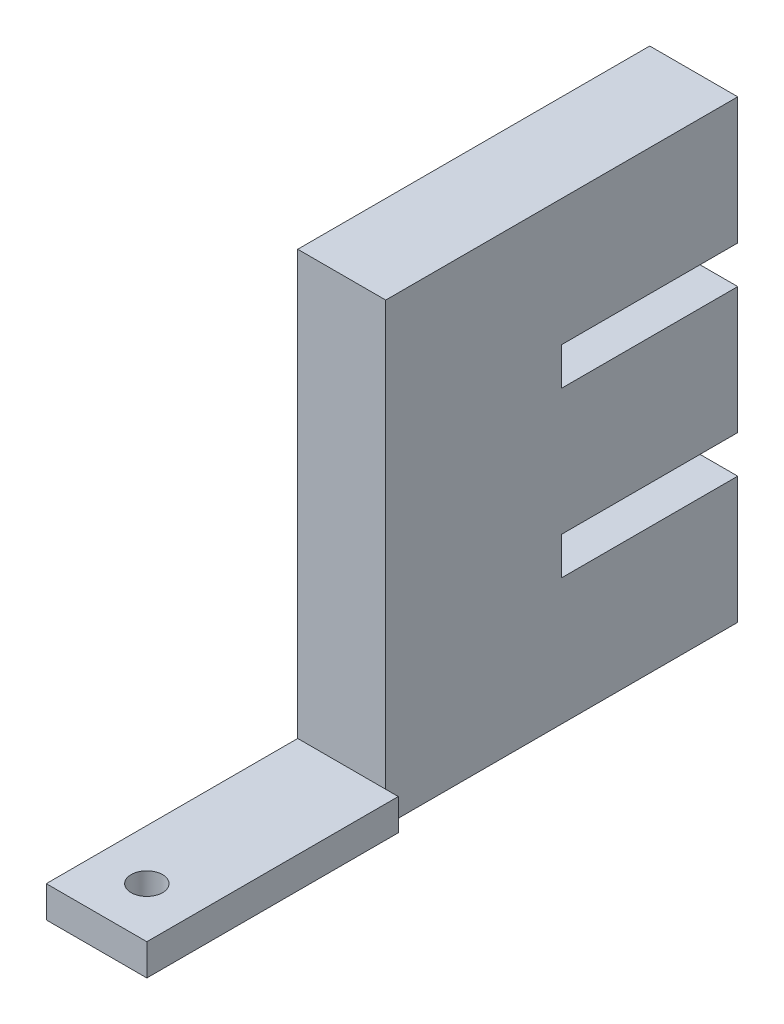
ISO-10303-21;
HEADER;
FILE_DESCRIPTION(('STEP AP214'),'2;1');
FILE_NAME('part.step','',(''),(''),'','','');
FILE_SCHEMA(('AUTOMOTIVE_DESIGN { 1 0 10303 214 1 1 1 1 }'));
ENDSEC;
DATA;
#1=APPLICATION_CONTEXT('core data for automotive mechanical design processes');
#2=APPLICATION_PROTOCOL_DEFINITION('international standard','automotive_design',2000,#1);
#3=PRODUCT_CONTEXT('',#1,'mechanical');
#4=PRODUCT('Part','Part','',(#3));
#5=PRODUCT_RELATED_PRODUCT_CATEGORY('part','',(#4));
#6=PRODUCT_DEFINITION_FORMATION('','',#4);
#7=PRODUCT_DEFINITION_CONTEXT('part definition',#1,'design');
#8=PRODUCT_DEFINITION('design','',#6,#7);
#9=PRODUCT_DEFINITION_SHAPE('','',#8);
#10=(LENGTH_UNIT() NAMED_UNIT(*) SI_UNIT(.MILLI.,.METRE.));
#11=(NAMED_UNIT(*) PLANE_ANGLE_UNIT() SI_UNIT($,.RADIAN.));
#12=(NAMED_UNIT(*) SI_UNIT($,.STERADIAN.) SOLID_ANGLE_UNIT());
#13=UNCERTAINTY_MEASURE_WITH_UNIT(LENGTH_MEASURE(1.E-05),#10,'distance_accuracy_value','');
#14=(GEOMETRIC_REPRESENTATION_CONTEXT(3) GLOBAL_UNCERTAINTY_ASSIGNED_CONTEXT((#13)) GLOBAL_UNIT_ASSIGNED_CONTEXT((#10,
#11,#12)) REPRESENTATION_CONTEXT('',''));
#15=CARTESIAN_POINT('',(0.,0.,0.));
#16=DIRECTION('',(0.,0.,1.));
#17=DIRECTION('',(1.,0.,0.));
#18=AXIS2_PLACEMENT_3D('',#15,#16,#17);
#19=CARTESIAN_POINT('',(-4.,-2.,4.));
#20=DIRECTION('',(1.,0.,0.));
#21=DIRECTION('',(0.,0.,-1.));
#22=AXIS2_PLACEMENT_3D('',#19,#20,#21);
#23=PLANE('',#22);
#24=DIRECTION('',(0.,0.,1.));
#25=VECTOR('',#24,1.);
#26=CARTESIAN_POINT('',(-4.,18.63,4.));
#27=LINE('',#26,#25);
#28=CARTESIAN_POINT('',(-4.,18.63,-44.));
#29=VERTEX_POINT('',#28);
#30=CARTESIAN_POINT('',(-4.,18.63,-30.));
#31=VERTEX_POINT('',#30);
#32=EDGE_CURVE('E175',#29,#31,#27,.T.);
#33=ORIENTED_EDGE('',*,*,#32,.F.);
#34=DIRECTION('',(0.,-1.,0.));
#35=VECTOR('',#34,1.);
#36=CARTESIAN_POINT('',(-4.,31.7,-44.));
#37=LINE('',#36,#35);
#38=CARTESIAN_POINT('',(-4.,8.57,-44.));
#39=VERTEX_POINT('',#38);
#40=EDGE_CURVE('E63',#29,#39,#37,.T.);
#41=ORIENTED_EDGE('',*,*,#40,.T.);
#42=DIRECTION('',(0.,0.,-1.));
#43=VECTOR('',#42,1.);
#44=CARTESIAN_POINT('',(-4.,8.57,4.));
#45=LINE('',#44,#43);
#46=CARTESIAN_POINT('',(-4.,8.57,-30.));
#47=VERTEX_POINT('',#46);
#48=EDGE_CURVE('E187',#47,#39,#45,.T.);
#49=ORIENTED_EDGE('',*,*,#48,.F.);
#50=DIRECTION('',(0.,-1.,0.));
#51=VECTOR('',#50,1.);
#52=CARTESIAN_POINT('',(-4.,-2.,-30.));
#53=LINE('',#52,#51);
#54=CARTESIAN_POINT('',(-4.,5.57,-30.));
#55=VERTEX_POINT('',#54);
#56=EDGE_CURVE('E193',#47,#55,#53,.T.);
#57=ORIENTED_EDGE('',*,*,#56,.T.);
#58=DIRECTION('',(0.,0.,1.));
#59=VECTOR('',#58,1.);
#60=CARTESIAN_POINT('',(-4.,5.57,4.));
#61=LINE('',#60,#59);
#62=CARTESIAN_POINT('',(-4.,5.57,-44.));
#63=VERTEX_POINT('',#62);
#64=EDGE_CURVE('E192',#63,#55,#61,.T.);
#65=ORIENTED_EDGE('',*,*,#64,.F.);
#66=CARTESIAN_POINT('',(-4.,-4.5,-44.));
#67=VERTEX_POINT('',#66);
#68=EDGE_CURVE('E203',#63,#67,#37,.T.);
#69=ORIENTED_EDGE('',*,*,#68,.T.);
#70=DIRECTION('',(0.,0.,-1.));
#71=VECTOR('',#70,1.);
#72=CARTESIAN_POINT('',(-4.,-4.5,4.));
#73=LINE('',#72,#71);
#74=CARTESIAN_POINT('',(-4.,-4.5,4.));
#75=VERTEX_POINT('',#74);
#76=EDGE_CURVE('E258',#75,#67,#73,.T.);
#77=ORIENTED_EDGE('',*,*,#76,.F.);
#78=DIRECTION('',(0.,-1.,0.));
#79=VECTOR('',#78,1.);
#80=CARTESIAN_POINT('',(-4.,-2.,4.));
#81=LINE('',#80,#79);
#82=CARTESIAN_POINT('',(-4.,-2.,4.));
#83=VERTEX_POINT('',#82);
#84=EDGE_CURVE('E231',#83,#75,#81,.T.);
#85=ORIENTED_EDGE('',*,*,#84,.F.);
#86=DIRECTION('',(0.,0.,-1.));
#87=VECTOR('',#86,1.);
#88=CARTESIAN_POINT('',(-4.,-2.,4.));
#89=LINE('',#88,#87);
#90=CARTESIAN_POINT('',(-4.,-2.,-16.));
#91=VERTEX_POINT('',#90);
#92=EDGE_CURVE('E243',#83,#91,#89,.T.);
#93=ORIENTED_EDGE('',*,*,#92,.T.);
#94=DIRECTION('',(0.,-1.,0.));
#95=VECTOR('',#94,1.);
#96=CARTESIAN_POINT('',(-4.,31.7,-16.));
#97=LINE('',#96,#95);
#98=CARTESIAN_POINT('',(-4.,31.7,-16.));
#99=VERTEX_POINT('',#98);
#100=EDGE_CURVE('E205',#99,#91,#97,.T.);
#101=ORIENTED_EDGE('',*,*,#100,.F.);
#102=DIRECTION('',(0.,0.,-1.));
#103=VECTOR('',#102,1.);
#104=CARTESIAN_POINT('',(-4.,31.7,-16.));
#105=LINE('',#104,#103);
#106=CARTESIAN_POINT('',(-4.,31.7,-44.));
#107=VERTEX_POINT('',#106);
#108=EDGE_CURVE('E211',#99,#107,#105,.T.);
#109=ORIENTED_EDGE('',*,*,#108,.T.);
#110=CARTESIAN_POINT('',(-4.,21.63,-44.));
#111=VERTEX_POINT('',#110);
#112=EDGE_CURVE('E215',#107,#111,#37,.T.);
#113=ORIENTED_EDGE('',*,*,#112,.T.);
#114=DIRECTION('',(0.,0.,-1.));
#115=VECTOR('',#114,1.);
#116=CARTESIAN_POINT('',(-4.,21.63,4.));
#117=LINE('',#116,#115);
#118=CARTESIAN_POINT('',(-4.,21.63,-30.));
#119=VERTEX_POINT('',#118);
#120=EDGE_CURVE('E52',#119,#111,#117,.T.);
#121=ORIENTED_EDGE('',*,*,#120,.F.);
#122=DIRECTION('',(0.,-1.,0.));
#123=VECTOR('',#122,1.);
#124=CARTESIAN_POINT('',(-4.,-2.,-30.));
#125=LINE('',#124,#123);
#126=EDGE_CURVE('E165',#119,#31,#125,.T.);
#127=ORIENTED_EDGE('',*,*,#126,.T.);
#128=EDGE_LOOP('',(#33,#41,#49,#57,#65,#69,#77,#85,#93,#101,#109,#113,#121,#127));
#129=FACE_BOUND('',#128,.T.);
#130=ADVANCED_FACE('F39',(#129),#23,.F.);
#131=CARTESIAN_POINT('',(3.,-4.5,-16.));
#132=DIRECTION('',(-1.,0.,0.));
#133=DIRECTION('',(0.,0.,1.));
#134=AXIS2_PLACEMENT_3D('',#131,#132,#133);
#135=PLANE('',#134);
#136=DIRECTION('',(0.,0.,-1.));
#137=VECTOR('',#136,1.);
#138=CARTESIAN_POINT('',(3.,18.63,-16.));
#139=LINE('',#138,#137);
#140=CARTESIAN_POINT('',(3.,18.63,-30.));
#141=VERTEX_POINT('',#140);
#142=CARTESIAN_POINT('',(3.,18.63,-44.));
#143=VERTEX_POINT('',#142);
#144=EDGE_CURVE('E169',#141,#143,#139,.T.);
#145=ORIENTED_EDGE('',*,*,#144,.F.);
#146=DIRECTION('',(0.,1.,0.));
#147=VECTOR('',#146,1.);
#148=CARTESIAN_POINT('',(3.,-4.5,-30.));
#149=LINE('',#148,#147);
#150=CARTESIAN_POINT('',(3.,21.63,-30.));
#151=VERTEX_POINT('',#150);
#152=EDGE_CURVE('E11',#141,#151,#149,.T.);
#153=ORIENTED_EDGE('',*,*,#152,.T.);
#154=DIRECTION('',(0.,0.,1.));
#155=VECTOR('',#154,1.);
#156=CARTESIAN_POINT('',(3.,21.63,-16.));
#157=LINE('',#156,#155);
#158=CARTESIAN_POINT('',(3.,21.63,-44.));
#159=VERTEX_POINT('',#158);
#160=EDGE_CURVE('E149',#159,#151,#157,.T.);
#161=ORIENTED_EDGE('',*,*,#160,.F.);
#162=DIRECTION('',(0.,1.,0.));
#163=VECTOR('',#162,1.);
#164=CARTESIAN_POINT('',(3.,-4.5,-44.));
#165=LINE('',#164,#163);
#166=CARTESIAN_POINT('',(3.,31.7,-44.));
#167=VERTEX_POINT('',#166);
#168=EDGE_CURVE('E220',#159,#167,#165,.T.);
#169=ORIENTED_EDGE('',*,*,#168,.T.);
#170=DIRECTION('',(0.,0.,-1.));
#171=VECTOR('',#170,1.);
#172=CARTESIAN_POINT('',(3.,31.7,-16.));
#173=LINE('',#172,#171);
#174=CARTESIAN_POINT('',(3.,31.7,-16.));
#175=VERTEX_POINT('',#174);
#176=EDGE_CURVE('E221',#175,#167,#173,.T.);
#177=ORIENTED_EDGE('',*,*,#176,.F.);
#178=DIRECTION('',(0.,1.,0.));
#179=VECTOR('',#178,1.);
#180=CARTESIAN_POINT('',(3.,-4.5,-16.));
#181=LINE('',#180,#179);
#182=CARTESIAN_POINT('',(3.,-2.,-16.));
#183=VERTEX_POINT('',#182);
#184=EDGE_CURVE('E204',#183,#175,#181,.T.);
#185=ORIENTED_EDGE('',*,*,#184,.F.);
#186=CARTESIAN_POINT('',(3.,-4.5,-16.));
#187=VERTEX_POINT('',#186);
#188=EDGE_CURVE('E206',#187,#183,#181,.T.);
#189=ORIENTED_EDGE('',*,*,#188,.F.);
#190=DIRECTION('',(0.,0.,-1.));
#191=VECTOR('',#190,1.);
#192=CARTESIAN_POINT('',(3.,-4.5,-16.));
#193=LINE('',#192,#191);
#194=CARTESIAN_POINT('',(3.,-4.5,-44.));
#195=VERTEX_POINT('',#194);
#196=EDGE_CURVE('E229',#187,#195,#193,.T.);
#197=ORIENTED_EDGE('',*,*,#196,.T.);
#198=CARTESIAN_POINT('',(3.,5.57,-44.));
#199=VERTEX_POINT('',#198);
#200=EDGE_CURVE('E217',#195,#199,#165,.T.);
#201=ORIENTED_EDGE('',*,*,#200,.T.);
#202=DIRECTION('',(0.,0.,-1.));
#203=VECTOR('',#202,1.);
#204=CARTESIAN_POINT('',(3.,5.57,-16.));
#205=LINE('',#204,#203);
#206=CARTESIAN_POINT('',(3.,5.57,-30.));
#207=VERTEX_POINT('',#206);
#208=EDGE_CURVE('E186',#207,#199,#205,.T.);
#209=ORIENTED_EDGE('',*,*,#208,.F.);
#210=DIRECTION('',(0.,1.,0.));
#211=VECTOR('',#210,1.);
#212=CARTESIAN_POINT('',(3.,-4.5,-30.));
#213=LINE('',#212,#211);
#214=CARTESIAN_POINT('',(3.,8.57,-30.));
#215=VERTEX_POINT('',#214);
#216=EDGE_CURVE('E264',#207,#215,#213,.T.);
#217=ORIENTED_EDGE('',*,*,#216,.T.);
#218=DIRECTION('',(0.,0.,1.));
#219=VECTOR('',#218,1.);
#220=CARTESIAN_POINT('',(3.,8.57,-16.));
#221=LINE('',#220,#219);
#222=CARTESIAN_POINT('',(3.,8.57,-44.));
#223=VERTEX_POINT('',#222);
#224=EDGE_CURVE('E188',#223,#215,#221,.T.);
#225=ORIENTED_EDGE('',*,*,#224,.F.);
#226=EDGE_CURVE('E173',#223,#143,#165,.T.);
#227=ORIENTED_EDGE('',*,*,#226,.T.);
#228=EDGE_LOOP('',(#145,#153,#161,#169,#177,#185,#189,#197,#201,#209,#217,#225,#227));
#229=FACE_BOUND('',#228,.T.);
#230=ADVANCED_FACE('F167',(#229),#135,.F.);
#231=CARTESIAN_POINT('',(0.,0.,-44.));
#232=DIRECTION('',(0.,0.,1.));
#233=DIRECTION('',(1.,0.,0.));
#234=AXIS2_PLACEMENT_3D('',#231,#232,#233);
#235=PLANE('',#234);
#236=DIRECTION('',(-1.,0.,0.));
#237=VECTOR('',#236,1.);
#238=CARTESIAN_POINT('',(0.,18.63,-44.));
#239=LINE('',#238,#237);
#240=EDGE_CURVE('E46',#143,#29,#239,.T.);
#241=ORIENTED_EDGE('',*,*,#240,.F.);
#242=ORIENTED_EDGE('',*,*,#226,.F.);
#243=DIRECTION('',(1.,0.,0.));
#244=VECTOR('',#243,1.);
#245=CARTESIAN_POINT('',(0.,8.57,-44.));
#246=LINE('',#245,#244);
#247=EDGE_CURVE('E259',#39,#223,#246,.T.);
#248=ORIENTED_EDGE('',*,*,#247,.F.);
#249=ORIENTED_EDGE('',*,*,#40,.F.);
#250=EDGE_LOOP('',(#241,#242,#248,#249));
#251=FACE_BOUND('',#250,.T.);
#252=ADVANCED_FACE('F271',(#251),#235,.F.);
#253=DIRECTION('',(1.,0.,0.));
#254=VECTOR('',#253,1.);
#255=CARTESIAN_POINT('',(0.,21.63,-44.));
#256=LINE('',#255,#254);
#257=EDGE_CURVE('E153',#111,#159,#256,.T.);
#258=ORIENTED_EDGE('',*,*,#257,.F.);
#259=ORIENTED_EDGE('',*,*,#112,.F.);
#260=DIRECTION('',(-1.,0.,0.));
#261=VECTOR('',#260,1.);
#262=CARTESIAN_POINT('',(3.,31.7,-44.));
#263=LINE('',#262,#261);
#264=EDGE_CURVE('E202',#167,#107,#263,.T.);
#265=ORIENTED_EDGE('',*,*,#264,.F.);
#266=ORIENTED_EDGE('',*,*,#168,.F.);
#267=EDGE_LOOP('',(#258,#259,#265,#266));
#268=FACE_BOUND('',#267,.T.);
#269=ADVANCED_FACE('F314',(#268),#235,.F.);
#270=DIRECTION('',(-1.,0.,0.));
#271=VECTOR('',#270,1.);
#272=CARTESIAN_POINT('',(0.,5.57,-44.));
#273=LINE('',#272,#271);
#274=EDGE_CURVE('E263',#199,#63,#273,.T.);
#275=ORIENTED_EDGE('',*,*,#274,.F.);
#276=ORIENTED_EDGE('',*,*,#200,.F.);
#277=DIRECTION('',(1.,0.,0.));
#278=VECTOR('',#277,1.);
#279=CARTESIAN_POINT('',(-4.,-4.5,-44.));
#280=LINE('',#279,#278);
#281=EDGE_CURVE('E214',#67,#195,#280,.T.);
#282=ORIENTED_EDGE('',*,*,#281,.F.);
#283=ORIENTED_EDGE('',*,*,#68,.F.);
#284=EDGE_LOOP('',(#275,#276,#282,#283));
#285=FACE_BOUND('',#284,.T.);
#286=ADVANCED_FACE('F282',(#285),#235,.F.);
#287=CARTESIAN_POINT('',(-4.,-4.5,4.));
#288=DIRECTION('',(0.,1.,0.));
#289=DIRECTION('',(0.,0.,1.));
#290=AXIS2_PLACEMENT_3D('',#287,#288,#289);
#291=PLANE('',#290);
#292=CARTESIAN_POINT('',(0.,-4.5,0.));
#293=DIRECTION('',(0.,1.,0.));
#294=DIRECTION('',(0.,0.,1.));
#295=AXIS2_PLACEMENT_3D('',#292,#293,#294);
#296=CIRCLE('',#295,1.25);
#297=CARTESIAN_POINT('',(0.,-4.5,1.25));
#298=VERTEX_POINT('',#297);
#299=EDGE_CURVE('E196',#298,#298,#296,.F.);
#300=ORIENTED_EDGE('',*,*,#299,.F.);
#301=EDGE_LOOP('',(#300));
#302=FACE_BOUND('',#301,.T.);
#303=ORIENTED_EDGE('',*,*,#76,.T.);
#304=ORIENTED_EDGE('',*,*,#281,.T.);
#305=ORIENTED_EDGE('',*,*,#196,.F.);
#306=DIRECTION('',(1.,0.,0.));
#307=VECTOR('',#306,1.);
#308=CARTESIAN_POINT('',(-4.,-4.5,-16.));
#309=LINE('',#308,#307);
#310=CARTESIAN_POINT('',(4.,-4.5,-16.));
#311=VERTEX_POINT('',#310);
#312=EDGE_CURVE('E226',#187,#311,#309,.T.);
#313=ORIENTED_EDGE('',*,*,#312,.T.);
#314=DIRECTION('',(0.,0.,-1.));
#315=VECTOR('',#314,1.);
#316=CARTESIAN_POINT('',(4.,-4.5,4.));
#317=LINE('',#316,#315);
#318=CARTESIAN_POINT('',(4.,-4.5,4.));
#319=VERTEX_POINT('',#318);
#320=EDGE_CURVE('E251',#319,#311,#317,.T.);
#321=ORIENTED_EDGE('',*,*,#320,.F.);
#322=DIRECTION('',(1.,0.,0.));
#323=VECTOR('',#322,1.);
#324=CARTESIAN_POINT('',(-4.,-4.5,4.));
#325=LINE('',#324,#323);
#326=EDGE_CURVE('E233',#75,#319,#325,.T.);
#327=ORIENTED_EDGE('',*,*,#326,.F.);
#328=EDGE_LOOP('',(#303,#304,#305,#313,#321,#327));
#329=FACE_BOUND('',#328,.T.);
#330=ADVANCED_FACE('F278',(#302,#329),#291,.F.);
#331=CARTESIAN_POINT('',(4.,-4.5,4.));
#332=DIRECTION('',(-1.,0.,0.));
#333=DIRECTION('',(0.,0.,1.));
#334=AXIS2_PLACEMENT_3D('',#331,#332,#333);
#335=PLANE('',#334);
#336=DIRECTION('',(0.,1.,0.));
#337=VECTOR('',#336,1.);
#338=CARTESIAN_POINT('',(4.,-4.5,-16.));
#339=LINE('',#338,#337);
#340=CARTESIAN_POINT('',(4.,-2.,-16.));
#341=VERTEX_POINT('',#340);
#342=EDGE_CURVE('E242',#311,#341,#339,.T.);
#343=ORIENTED_EDGE('',*,*,#342,.T.);
#344=DIRECTION('',(0.,0.,-1.));
#345=VECTOR('',#344,1.);
#346=CARTESIAN_POINT('',(4.,-2.,4.));
#347=LINE('',#346,#345);
#348=CARTESIAN_POINT('',(4.,-2.,4.));
#349=VERTEX_POINT('',#348);
#350=EDGE_CURVE('E250',#349,#341,#347,.T.);
#351=ORIENTED_EDGE('',*,*,#350,.F.);
#352=DIRECTION('',(0.,1.,0.));
#353=VECTOR('',#352,1.);
#354=CARTESIAN_POINT('',(4.,-4.5,4.));
#355=LINE('',#354,#353);
#356=EDGE_CURVE('E240',#319,#349,#355,.T.);
#357=ORIENTED_EDGE('',*,*,#356,.F.);
#358=ORIENTED_EDGE('',*,*,#320,.T.);
#359=EDGE_LOOP('',(#343,#351,#357,#358));
#360=FACE_BOUND('',#359,.T.);
#361=ADVANCED_FACE('F292',(#360),#335,.F.);
#362=CARTESIAN_POINT('',(4.,-2.,4.));
#363=DIRECTION('',(0.,-1.,0.));
#364=DIRECTION('',(0.,0.,-1.));
#365=AXIS2_PLACEMENT_3D('',#362,#363,#364);
#366=PLANE('',#365);
#367=CARTESIAN_POINT('',(0.,-2.,0.));
#368=DIRECTION('',(0.,-1.,0.));
#369=DIRECTION('',(0.,0.,-1.));
#370=AXIS2_PLACEMENT_3D('',#367,#368,#369);
#371=CIRCLE('',#370,1.25);
#372=CARTESIAN_POINT('',(0.,-2.,-1.25));
#373=VERTEX_POINT('',#372);
#374=EDGE_CURVE('E197',#373,#373,#371,.F.);
#375=ORIENTED_EDGE('',*,*,#374,.F.);
#376=EDGE_LOOP('',(#375));
#377=FACE_BOUND('',#376,.T.);
#378=DIRECTION('',(-1.,0.,0.));
#379=VECTOR('',#378,1.);
#380=CARTESIAN_POINT('',(4.,-2.,-16.));
#381=LINE('',#380,#379);
#382=EDGE_CURVE('E235',#341,#183,#381,.T.);
#383=ORIENTED_EDGE('',*,*,#382,.T.);
#384=EDGE_CURVE('E241',#183,#91,#381,.T.);
#385=ORIENTED_EDGE('',*,*,#384,.T.);
#386=ORIENTED_EDGE('',*,*,#92,.F.);
#387=DIRECTION('',(-1.,0.,0.));
#388=VECTOR('',#387,1.);
#389=CARTESIAN_POINT('',(4.,-2.,4.));
#390=LINE('',#389,#388);
#391=EDGE_CURVE('E239',#349,#83,#390,.T.);
#392=ORIENTED_EDGE('',*,*,#391,.F.);
#393=ORIENTED_EDGE('',*,*,#350,.T.);
#394=EDGE_LOOP('',(#383,#385,#386,#392,#393));
#395=FACE_BOUND('',#394,.T.);
#396=ADVANCED_FACE('F299',(#377,#395),#366,.F.);
#397=CARTESIAN_POINT('',(0.,0.,4.));
#398=DIRECTION('',(0.,0.,1.));
#399=DIRECTION('',(1.,0.,0.));
#400=AXIS2_PLACEMENT_3D('',#397,#398,#399);
#401=PLANE('',#400);
#402=ORIENTED_EDGE('',*,*,#84,.T.);
#403=ORIENTED_EDGE('',*,*,#326,.T.);
#404=ORIENTED_EDGE('',*,*,#356,.T.);
#405=ORIENTED_EDGE('',*,*,#391,.T.);
#406=EDGE_LOOP('',(#402,#403,#404,#405));
#407=FACE_BOUND('',#406,.T.);
#408=ADVANCED_FACE('F302',(#407),#401,.T.);
#409=CARTESIAN_POINT('',(0.,0.,-16.));
#410=DIRECTION('',(0.,0.,1.));
#411=DIRECTION('',(1.,0.,0.));
#412=AXIS2_PLACEMENT_3D('',#409,#410,#411);
#413=PLANE('',#412);
#414=ORIENTED_EDGE('',*,*,#312,.F.);
#415=ORIENTED_EDGE('',*,*,#188,.T.);
#416=ORIENTED_EDGE('',*,*,#382,.F.);
#417=ORIENTED_EDGE('',*,*,#342,.F.);
#418=EDGE_LOOP('',(#414,#415,#416,#417));
#419=FACE_BOUND('',#418,.T.);
#420=ADVANCED_FACE('F294',(#419),#413,.F.);
#421=CARTESIAN_POINT('',(0.,0.,-16.));
#422=DIRECTION('',(0.,0.,1.));
#423=DIRECTION('',(1.,0.,0.));
#424=AXIS2_PLACEMENT_3D('',#421,#422,#423);
#425=PLANE('',#424);
#426=ORIENTED_EDGE('',*,*,#384,.F.);
#427=ORIENTED_EDGE('',*,*,#184,.T.);
#428=DIRECTION('',(-1.,0.,0.));
#429=VECTOR('',#428,1.);
#430=CARTESIAN_POINT('',(3.,31.7,-16.));
#431=LINE('',#430,#429);
#432=EDGE_CURVE('E207',#175,#99,#431,.T.);
#433=ORIENTED_EDGE('',*,*,#432,.T.);
#434=ORIENTED_EDGE('',*,*,#100,.T.);
#435=EDGE_LOOP('',(#426,#427,#433,#434));
#436=FACE_BOUND('',#435,.T.);
#437=ADVANCED_FACE('F307',(#436),#425,.T.);
#438=CARTESIAN_POINT('',(3.,31.7,-16.));
#439=DIRECTION('',(0.,-1.,0.));
#440=DIRECTION('',(0.,0.,-1.));
#441=AXIS2_PLACEMENT_3D('',#438,#439,#440);
#442=PLANE('',#441);
#443=ORIENTED_EDGE('',*,*,#264,.T.);
#444=ORIENTED_EDGE('',*,*,#108,.F.);
#445=ORIENTED_EDGE('',*,*,#432,.F.);
#446=ORIENTED_EDGE('',*,*,#176,.T.);
#447=EDGE_LOOP('',(#443,#444,#445,#446));
#448=FACE_BOUND('',#447,.T.);
#449=ADVANCED_FACE('F313',(#448),#442,.F.);
#450=CARTESIAN_POINT('',(0.,-1.9,0.));
#451=DIRECTION('',(0.,-1.,0.));
#452=DIRECTION('',(0.,0.,-1.));
#453=AXIS2_PLACEMENT_3D('',#450,#451,#452);
#454=CYLINDRICAL_SURFACE('',#453,1.25);
#455=ORIENTED_EDGE('',*,*,#374,.T.);
#456=EDGE_LOOP('',(#455));
#457=FACE_BOUND('',#456,.T.);
#458=ORIENTED_EDGE('',*,*,#299,.T.);
#459=EDGE_LOOP('',(#458));
#460=FACE_BOUND('',#459,.T.);
#461=ADVANCED_FACE('F346',(#457,#460),#454,.F.);
#462=CARTESIAN_POINT('',(0.,0.,-30.));
#463=DIRECTION('',(0.,0.,1.));
#464=DIRECTION('',(1.,0.,0.));
#465=AXIS2_PLACEMENT_3D('',#462,#463,#464);
#466=PLANE('',#465);
#467=DIRECTION('',(-1.,0.,0.));
#468=VECTOR('',#467,1.);
#469=CARTESIAN_POINT('',(3.1,8.57,-30.));
#470=LINE('',#469,#468);
#471=EDGE_CURVE('E181',#215,#47,#470,.T.);
#472=ORIENTED_EDGE('',*,*,#471,.F.);
#473=ORIENTED_EDGE('',*,*,#216,.F.);
#474=DIRECTION('',(1.,0.,0.));
#475=VECTOR('',#474,1.);
#476=CARTESIAN_POINT('',(-4.1,5.57,-30.));
#477=LINE('',#476,#475);
#478=EDGE_CURVE('E180',#55,#207,#477,.T.);
#479=ORIENTED_EDGE('',*,*,#478,.F.);
#480=ORIENTED_EDGE('',*,*,#56,.F.);
#481=EDGE_LOOP('',(#472,#473,#479,#480));
#482=FACE_BOUND('',#481,.T.);
#483=ADVANCED_FACE('F348',(#482),#466,.F.);
#484=CARTESIAN_POINT('',(-4.1,5.57,-30.));
#485=DIRECTION('',(0.,1.,0.));
#486=DIRECTION('',(0.,0.,1.));
#487=AXIS2_PLACEMENT_3D('',#484,#485,#486);
#488=PLANE('',#487);
#489=ORIENTED_EDGE('',*,*,#64,.T.);
#490=ORIENTED_EDGE('',*,*,#478,.T.);
#491=ORIENTED_EDGE('',*,*,#208,.T.);
#492=ORIENTED_EDGE('',*,*,#274,.T.);
#493=EDGE_LOOP('',(#489,#490,#491,#492));
#494=FACE_BOUND('',#493,.T.);
#495=ADVANCED_FACE('F356',(#494),#488,.T.);
#496=CARTESIAN_POINT('',(3.1,8.57,-30.));
#497=DIRECTION('',(0.,-1.,0.));
#498=DIRECTION('',(0.,0.,-1.));
#499=AXIS2_PLACEMENT_3D('',#496,#497,#498);
#500=PLANE('',#499);
#501=ORIENTED_EDGE('',*,*,#48,.T.);
#502=ORIENTED_EDGE('',*,*,#247,.T.);
#503=ORIENTED_EDGE('',*,*,#224,.T.);
#504=ORIENTED_EDGE('',*,*,#471,.T.);
#505=EDGE_LOOP('',(#501,#502,#503,#504));
#506=FACE_BOUND('',#505,.T.);
#507=ADVANCED_FACE('F396',(#506),#500,.T.);
#508=CARTESIAN_POINT('',(0.,0.,-30.));
#509=DIRECTION('',(0.,0.,1.));
#510=DIRECTION('',(1.,0.,0.));
#511=AXIS2_PLACEMENT_3D('',#508,#509,#510);
#512=PLANE('',#511);
#513=DIRECTION('',(-1.,0.,0.));
#514=VECTOR('',#513,1.);
#515=CARTESIAN_POINT('',(3.1,21.63,-30.));
#516=LINE('',#515,#514);
#517=EDGE_CURVE('E155',#151,#119,#516,.T.);
#518=ORIENTED_EDGE('',*,*,#517,.F.);
#519=ORIENTED_EDGE('',*,*,#152,.F.);
#520=DIRECTION('',(1.,0.,0.));
#521=VECTOR('',#520,1.);
#522=CARTESIAN_POINT('',(-4.1,18.63,-30.));
#523=LINE('',#522,#521);
#524=EDGE_CURVE('E162',#31,#141,#523,.T.);
#525=ORIENTED_EDGE('',*,*,#524,.F.);
#526=ORIENTED_EDGE('',*,*,#126,.F.);
#527=EDGE_LOOP('',(#518,#519,#525,#526));
#528=FACE_BOUND('',#527,.T.);
#529=ADVANCED_FACE('F158',(#528),#512,.F.);
#530=CARTESIAN_POINT('',(-4.1,18.63,-30.));
#531=DIRECTION('',(0.,1.,0.));
#532=DIRECTION('',(0.,0.,1.));
#533=AXIS2_PLACEMENT_3D('',#530,#531,#532);
#534=PLANE('',#533);
#535=ORIENTED_EDGE('',*,*,#32,.T.);
#536=ORIENTED_EDGE('',*,*,#524,.T.);
#537=ORIENTED_EDGE('',*,*,#144,.T.);
#538=ORIENTED_EDGE('',*,*,#240,.T.);
#539=EDGE_LOOP('',(#535,#536,#537,#538));
#540=FACE_BOUND('',#539,.T.);
#541=ADVANCED_FACE('F268',(#540),#534,.T.);
#542=CARTESIAN_POINT('',(3.1,21.63,-30.));
#543=DIRECTION('',(0.,-1.,0.));
#544=DIRECTION('',(0.,0.,-1.));
#545=AXIS2_PLACEMENT_3D('',#542,#543,#544);
#546=PLANE('',#545);
#547=ORIENTED_EDGE('',*,*,#120,.T.);
#548=ORIENTED_EDGE('',*,*,#257,.T.);
#549=ORIENTED_EDGE('',*,*,#160,.T.);
#550=ORIENTED_EDGE('',*,*,#517,.T.);
#551=EDGE_LOOP('',(#547,#548,#549,#550));
#552=FACE_BOUND('',#551,.T.);
#553=ADVANCED_FACE('F151',(#552),#546,.T.);
#554=CLOSED_SHELL('',(#130,#230,#252,#269,#286,#330,#361,#396,#408,#420,#437,#449,#461,#483,
#495,#507,#529,#541,#553));
#555=MANIFOLD_SOLID_BREP('B2',#554);
#556=ADVANCED_BREP_SHAPE_REPRESENTATION('',(#18,#555),#14);
#557=SHAPE_DEFINITION_REPRESENTATION(#9,#556);
ENDSEC;
END-ISO-10303-21;
